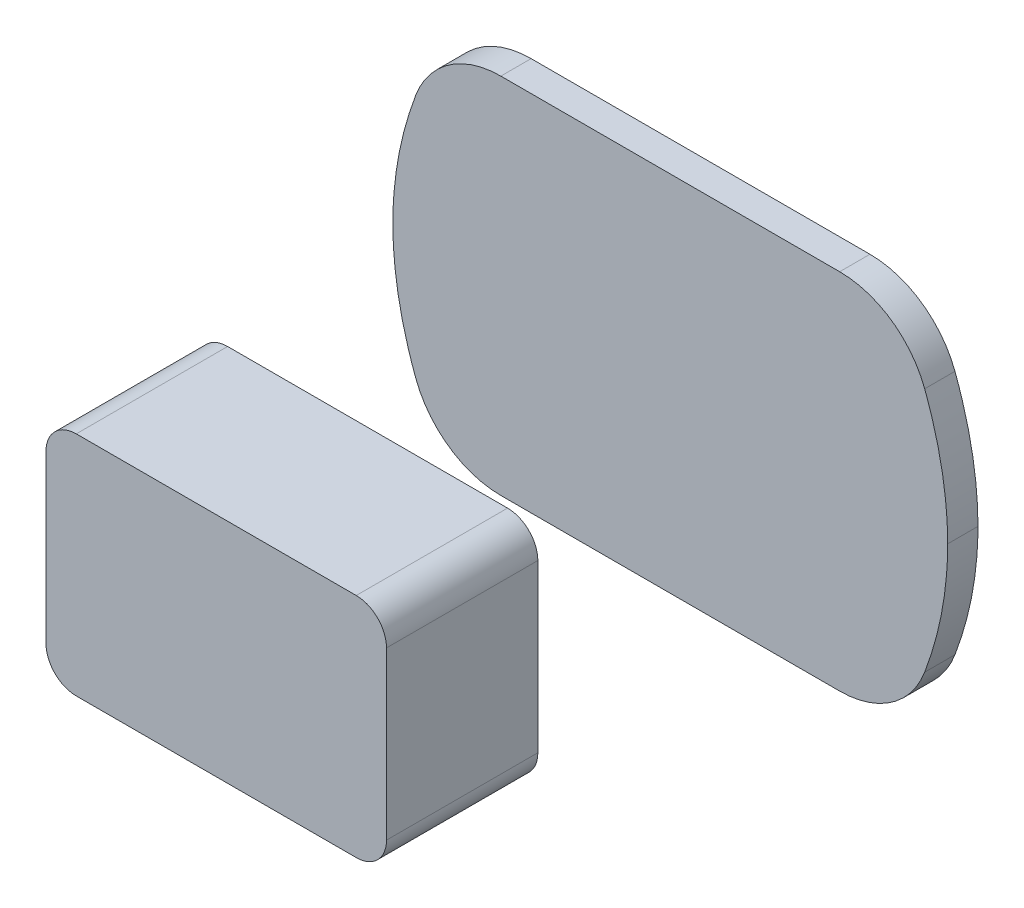
ISO-10303-21;
HEADER;
FILE_DESCRIPTION(('STEP AP214'),'2;1');
FILE_NAME('part.step','',(''),(''),'','','');
FILE_SCHEMA(('AUTOMOTIVE_DESIGN { 1 0 10303 214 1 1 1 1 }'));
ENDSEC;
DATA;
#1=APPLICATION_CONTEXT('core data for automotive mechanical design processes');
#2=APPLICATION_PROTOCOL_DEFINITION('international standard','automotive_design',2000,#1);
#3=PRODUCT_CONTEXT('',#1,'mechanical');
#4=PRODUCT('Part','Part','',(#3));
#5=PRODUCT_RELATED_PRODUCT_CATEGORY('part','',(#4));
#6=PRODUCT_DEFINITION_FORMATION('','',#4);
#7=PRODUCT_DEFINITION_CONTEXT('part definition',#1,'design');
#8=PRODUCT_DEFINITION('design','',#6,#7);
#9=PRODUCT_DEFINITION_SHAPE('','',#8);
#10=(LENGTH_UNIT() NAMED_UNIT(*) SI_UNIT(.MILLI.,.METRE.));
#11=(NAMED_UNIT(*) PLANE_ANGLE_UNIT() SI_UNIT($,.RADIAN.));
#12=(NAMED_UNIT(*) SI_UNIT($,.STERADIAN.) SOLID_ANGLE_UNIT());
#13=UNCERTAINTY_MEASURE_WITH_UNIT(LENGTH_MEASURE(1.E-05),#10,'distance_accuracy_value','');
#14=(GEOMETRIC_REPRESENTATION_CONTEXT(3) GLOBAL_UNCERTAINTY_ASSIGNED_CONTEXT((#13)) GLOBAL_UNIT_ASSIGNED_CONTEXT((#10,
#11,#12)) REPRESENTATION_CONTEXT('',''));
#15=CARTESIAN_POINT('',(0.,0.,0.));
#16=DIRECTION('',(0.,0.,1.));
#17=DIRECTION('',(1.,0.,0.));
#18=AXIS2_PLACEMENT_3D('',#15,#16,#17);
#19=CARTESIAN_POINT('',(-18.3347125977728,0.,-2.));
#20=CARTESIAN_POINT('',(-18.3271627106579,-2.72613066147478,-2.));
#21=CARTESIAN_POINT('',(-17.8195108498582,-5.42651764525177,-2.));
#22=CARTESIAN_POINT('',(-16.8116848744019,-8.10972166686572,-2.));
#23=B_SPLINE_CURVE_WITH_KNOTS('',3,(#19,#20,#21,#22),.UNSPECIFIED.,.F.,.F.,(4,4),
(0.502499344077156,0.83790507370678),.UNSPECIFIED.);
#24=DIRECTION('',(0.,0.,1.));
#25=VECTOR('',#24,1.);
#26=SURFACE_OF_LINEAR_EXTRUSION('',#23,#25);
#27=CARTESIAN_POINT('',(-18.3347125977728,0.,0.));
#28=CARTESIAN_POINT('',(-18.3271627106579,-2.72613066147478,0.));
#29=CARTESIAN_POINT('',(-17.8195108498582,-5.42651764525177,0.));
#30=CARTESIAN_POINT('',(-16.8116848744019,-8.10972166686572,0.));
#31=B_SPLINE_CURVE_WITH_KNOTS('',3,(#27,#28,#29,#30),.UNSPECIFIED.,.F.,.F.,(4,4),
(0.502499344077156,0.83790507370678),.UNSPECIFIED.);
#32=CARTESIAN_POINT('',(-18.3347125977728,0.,0.));
#33=VERTEX_POINT('',#32);
#34=CARTESIAN_POINT('',(-16.8116848744019,-8.10972166686573,0.));
#35=VERTEX_POINT('',#34);
#36=EDGE_CURVE('E158',#33,#35,#31,.T.);
#37=ORIENTED_EDGE('',*,*,#36,.F.);
#38=DIRECTION('',(0.,0.,1.));
#39=VECTOR('',#38,1.);
#40=CARTESIAN_POINT('',(-18.3347125977728,0.,-2.));
#41=LINE('',#40,#39);
#42=CARTESIAN_POINT('',(-18.3347125977728,0.,-2.));
#43=VERTEX_POINT('',#42);
#44=EDGE_CURVE('E12',#43,#33,#41,.T.);
#45=ORIENTED_EDGE('',*,*,#44,.F.);
#46=CARTESIAN_POINT('',(-16.8116848744019,-8.10972166686573,-2.));
#47=VERTEX_POINT('',#46);
#48=EDGE_CURVE('E210',#43,#47,#23,.T.);
#49=ORIENTED_EDGE('',*,*,#48,.T.);
#50=DIRECTION('',(0.,0.,1.));
#51=VECTOR('',#50,1.);
#52=CARTESIAN_POINT('',(-16.8116848744019,-8.10972166686573,-2.));
#53=LINE('',#52,#51);
#54=EDGE_CURVE('E49',#47,#35,#53,.T.);
#55=ORIENTED_EDGE('',*,*,#54,.T.);
#56=EDGE_LOOP('',(#37,#45,#49,#55));
#57=FACE_BOUND('',#56,.T.);
#58=ADVANCED_FACE('F45',(#57),#26,.T.);
#59=CARTESIAN_POINT('',(-16.8116848744019,8.10972166686572,-2.));
#60=CARTESIAN_POINT('',(-17.8195108498582,5.42651764525177,-2.));
#61=CARTESIAN_POINT('',(-18.3271627106579,2.72613066147478,-2.));
#62=CARTESIAN_POINT('',(-18.3347125977728,0.,-2.));
#63=B_SPLINE_CURVE_WITH_KNOTS('',3,(#59,#60,#61,#62),.UNSPECIFIED.,.F.,.F.,(4,4),
(0.502499344077156,0.83790507370678),.UNSPECIFIED.);
#64=DIRECTION('',(0.,0.,1.));
#65=VECTOR('',#64,1.);
#66=SURFACE_OF_LINEAR_EXTRUSION('',#63,#65);
#67=CARTESIAN_POINT('',(-16.8116848744019,8.10972166686572,0.));
#68=CARTESIAN_POINT('',(-17.8195108498582,5.42651764525177,0.));
#69=CARTESIAN_POINT('',(-18.3271627106579,2.72613066147478,0.));
#70=CARTESIAN_POINT('',(-18.3347125977728,0.,0.));
#71=B_SPLINE_CURVE_WITH_KNOTS('',3,(#67,#68,#69,#70),.UNSPECIFIED.,.F.,.F.,(4,4),
(0.502499344077156,0.83790507370678),.UNSPECIFIED.);
#72=CARTESIAN_POINT('',(-16.8116848744019,8.10972166686572,0.));
#73=VERTEX_POINT('',#72);
#74=EDGE_CURVE('E214',#73,#33,#71,.T.);
#75=ORIENTED_EDGE('',*,*,#74,.F.);
#76=DIRECTION('',(0.,0.,1.));
#77=VECTOR('',#76,1.);
#78=CARTESIAN_POINT('',(-16.8116848744019,8.10972166686572,-2.));
#79=LINE('',#78,#77);
#80=CARTESIAN_POINT('',(-16.8116848744019,8.10972166686572,-2.));
#81=VERTEX_POINT('',#80);
#82=EDGE_CURVE('E55',#81,#73,#79,.T.);
#83=ORIENTED_EDGE('',*,*,#82,.F.);
#84=EDGE_CURVE('E145',#81,#43,#63,.T.);
#85=ORIENTED_EDGE('',*,*,#84,.T.);
#86=ORIENTED_EDGE('',*,*,#44,.T.);
#87=EDGE_LOOP('',(#75,#83,#85,#86));
#88=FACE_BOUND('',#87,.T.);
#89=ADVANCED_FACE('F166',(#88),#66,.T.);
#90=CARTESIAN_POINT('',(-11.1948285927834,6.,-2.));
#91=DIRECTION('',(0.,0.,1.));
#92=DIRECTION('',(1.,0.,0.));
#93=AXIS2_PLACEMENT_3D('',#90,#91,#92);
#94=CYLINDRICAL_SURFACE('',#93,5.99999999999999);
#95=CARTESIAN_POINT('',(-11.1948285927834,6.,0.));
#96=DIRECTION('',(0.,0.,1.));
#97=DIRECTION('',(1.,0.,0.));
#98=AXIS2_PLACEMENT_3D('',#95,#96,#97);
#99=CIRCLE('',#98,5.99999999999999);
#100=CARTESIAN_POINT('',(-11.1948285927834,12.,0.));
#101=VERTEX_POINT('',#100);
#102=EDGE_CURVE('E132',#101,#73,#99,.T.);
#103=ORIENTED_EDGE('',*,*,#102,.F.);
#104=DIRECTION('',(0.,0.,1.));
#105=VECTOR('',#104,1.);
#106=CARTESIAN_POINT('',(-11.1948285927834,12.,-2.));
#107=LINE('',#106,#105);
#108=CARTESIAN_POINT('',(-11.1948285927834,12.,-2.));
#109=VERTEX_POINT('',#108);
#110=EDGE_CURVE('E127',#109,#101,#107,.T.);
#111=ORIENTED_EDGE('',*,*,#110,.F.);
#112=CARTESIAN_POINT('',(-11.1948285927834,6.,-2.));
#113=DIRECTION('',(0.,0.,1.));
#114=DIRECTION('',(1.,0.,0.));
#115=AXIS2_PLACEMENT_3D('',#112,#113,#114);
#116=CIRCLE('',#115,5.99999999999999);
#117=EDGE_CURVE('E130',#109,#81,#116,.T.);
#118=ORIENTED_EDGE('',*,*,#117,.T.);
#119=ORIENTED_EDGE('',*,*,#82,.T.);
#120=EDGE_LOOP('',(#103,#111,#118,#119));
#121=FACE_BOUND('',#120,.T.);
#122=ADVANCED_FACE('F129',(#121),#94,.T.);
#123=CARTESIAN_POINT('',(-11.1948285927834,12.,-2.));
#124=DIRECTION('',(0.,1.,0.));
#125=DIRECTION('',(0.,0.,1.));
#126=AXIS2_PLACEMENT_3D('',#123,#124,#125);
#127=PLANE('',#126);
#128=DIRECTION('',(-1.,0.,0.));
#129=VECTOR('',#128,1.);
#130=CARTESIAN_POINT('',(-11.1948285927834,12.,0.));
#131=LINE('',#130,#129);
#132=CARTESIAN_POINT('',(11.1948285927834,12.,0.));
#133=VERTEX_POINT('',#132);
#134=EDGE_CURVE('E222',#133,#101,#131,.T.);
#135=ORIENTED_EDGE('',*,*,#134,.F.);
#136=DIRECTION('',(0.,0.,1.));
#137=VECTOR('',#136,1.);
#138=CARTESIAN_POINT('',(11.1948285927834,12.,-2.));
#139=LINE('',#138,#137);
#140=CARTESIAN_POINT('',(11.1948285927834,12.,-2.));
#141=VERTEX_POINT('',#140);
#142=EDGE_CURVE('E137',#141,#133,#139,.T.);
#143=ORIENTED_EDGE('',*,*,#142,.F.);
#144=DIRECTION('',(-1.,0.,0.));
#145=VECTOR('',#144,1.);
#146=CARTESIAN_POINT('',(-11.1948285927834,12.,-2.));
#147=LINE('',#146,#145);
#148=EDGE_CURVE('E143',#141,#109,#147,.T.);
#149=ORIENTED_EDGE('',*,*,#148,.T.);
#150=ORIENTED_EDGE('',*,*,#110,.T.);
#151=EDGE_LOOP('',(#135,#143,#149,#150));
#152=FACE_BOUND('',#151,.T.);
#153=ADVANCED_FACE('F147',(#152),#127,.T.);
#154=CARTESIAN_POINT('',(11.1948285927834,6.,-2.));
#155=DIRECTION('',(0.,0.,1.));
#156=DIRECTION('',(1.,0.,0.));
#157=AXIS2_PLACEMENT_3D('',#154,#155,#156);
#158=CYLINDRICAL_SURFACE('',#157,5.99999999999999);
#159=CARTESIAN_POINT('',(11.1948285927834,6.,0.));
#160=DIRECTION('',(0.,0.,1.));
#161=DIRECTION('',(-1.,0.,0.));
#162=AXIS2_PLACEMENT_3D('',#159,#160,#161);
#163=CIRCLE('',#162,5.99999999999999);
#164=CARTESIAN_POINT('',(16.8116848744019,8.10972166686573,0.));
#165=VERTEX_POINT('',#164);
#166=EDGE_CURVE('E352',#165,#133,#163,.T.);
#167=ORIENTED_EDGE('',*,*,#166,.F.);
#168=DIRECTION('',(0.,0.,1.));
#169=VECTOR('',#168,1.);
#170=CARTESIAN_POINT('',(16.8116848744019,8.10972166686573,-2.));
#171=LINE('',#170,#169);
#172=CARTESIAN_POINT('',(16.8116848744019,8.10972166686573,-2.));
#173=VERTEX_POINT('',#172);
#174=EDGE_CURVE('E233',#173,#165,#171,.T.);
#175=ORIENTED_EDGE('',*,*,#174,.F.);
#176=CARTESIAN_POINT('',(11.1948285927834,6.,-2.));
#177=DIRECTION('',(0.,0.,1.));
#178=DIRECTION('',(-1.,0.,0.));
#179=AXIS2_PLACEMENT_3D('',#176,#177,#178);
#180=CIRCLE('',#179,5.99999999999999);
#181=EDGE_CURVE('E148',#173,#141,#180,.T.);
#182=ORIENTED_EDGE('',*,*,#181,.T.);
#183=ORIENTED_EDGE('',*,*,#142,.T.);
#184=EDGE_LOOP('',(#167,#175,#182,#183));
#185=FACE_BOUND('',#184,.T.);
#186=ADVANCED_FACE('F176',(#185),#158,.T.);
#187=CARTESIAN_POINT('',(18.3347125977728,0.,-2.));
#188=CARTESIAN_POINT('',(18.3271627106579,2.72613066147478,-2.));
#189=CARTESIAN_POINT('',(17.8195108498582,5.42651764525177,-2.));
#190=CARTESIAN_POINT('',(16.8116848744019,8.10972166686572,-2.));
#191=B_SPLINE_CURVE_WITH_KNOTS('',3,(#187,#188,#189,#190),.UNSPECIFIED.,.F.,.F.,(4,4),
(0.502499344077156,0.83790507370678),.UNSPECIFIED.);
#192=DIRECTION('',(0.,0.,1.));
#193=VECTOR('',#192,1.);
#194=SURFACE_OF_LINEAR_EXTRUSION('',#191,#193);
#195=CARTESIAN_POINT('',(18.3347125977728,0.,0.));
#196=CARTESIAN_POINT('',(18.3271627106579,2.72613066147478,0.));
#197=CARTESIAN_POINT('',(17.8195108498582,5.42651764525177,0.));
#198=CARTESIAN_POINT('',(16.8116848744019,8.10972166686572,0.));
#199=B_SPLINE_CURVE_WITH_KNOTS('',3,(#195,#196,#197,#198),.UNSPECIFIED.,.F.,.F.,(4,4),
(0.502499344077156,0.83790507370678),.UNSPECIFIED.);
#200=CARTESIAN_POINT('',(18.3347125977728,0.,0.));
#201=VERTEX_POINT('',#200);
#202=EDGE_CURVE('E344',#201,#165,#199,.T.);
#203=ORIENTED_EDGE('',*,*,#202,.F.);
#204=DIRECTION('',(0.,0.,1.));
#205=VECTOR('',#204,1.);
#206=CARTESIAN_POINT('',(18.3347125977728,0.,-2.));
#207=LINE('',#206,#205);
#208=CARTESIAN_POINT('',(18.3347125977728,0.,-2.));
#209=VERTEX_POINT('',#208);
#210=EDGE_CURVE('E235',#209,#201,#207,.T.);
#211=ORIENTED_EDGE('',*,*,#210,.F.);
#212=EDGE_CURVE('E150',#209,#173,#191,.T.);
#213=ORIENTED_EDGE('',*,*,#212,.T.);
#214=ORIENTED_EDGE('',*,*,#174,.T.);
#215=EDGE_LOOP('',(#203,#211,#213,#214));
#216=FACE_BOUND('',#215,.T.);
#217=ADVANCED_FACE('F179',(#216),#194,.T.);
#218=CARTESIAN_POINT('',(16.8116848744019,-8.10972166686572,-2.));
#219=CARTESIAN_POINT('',(17.8195108498582,-5.42651764525177,-2.));
#220=CARTESIAN_POINT('',(18.3271627106579,-2.72613066147478,-2.));
#221=CARTESIAN_POINT('',(18.3347125977728,0.,-2.));
#222=B_SPLINE_CURVE_WITH_KNOTS('',3,(#218,#219,#220,#221),.UNSPECIFIED.,.F.,.F.,(4,4),
(0.502499344077156,0.83790507370678),.UNSPECIFIED.);
#223=DIRECTION('',(0.,0.,1.));
#224=VECTOR('',#223,1.);
#225=SURFACE_OF_LINEAR_EXTRUSION('',#222,#224);
#226=CARTESIAN_POINT('',(16.8116848744019,-8.10972166686572,0.));
#227=CARTESIAN_POINT('',(17.8195108498582,-5.42651764525177,0.));
#228=CARTESIAN_POINT('',(18.3271627106579,-2.72613066147478,0.));
#229=CARTESIAN_POINT('',(18.3347125977728,0.,0.));
#230=B_SPLINE_CURVE_WITH_KNOTS('',3,(#226,#227,#228,#229),.UNSPECIFIED.,.F.,.F.,(4,4),
(0.502499344077156,0.83790507370678),.UNSPECIFIED.);
#231=CARTESIAN_POINT('',(16.8116848744019,-8.10972166686572,0.));
#232=VERTEX_POINT('',#231);
#233=EDGE_CURVE('E337',#232,#201,#230,.T.);
#234=ORIENTED_EDGE('',*,*,#233,.F.);
#235=DIRECTION('',(0.,0.,1.));
#236=VECTOR('',#235,1.);
#237=CARTESIAN_POINT('',(16.8116848744019,-8.10972166686572,-2.));
#238=LINE('',#237,#236);
#239=CARTESIAN_POINT('',(16.8116848744019,-8.10972166686572,-2.));
#240=VERTEX_POINT('',#239);
#241=EDGE_CURVE('E237',#240,#232,#238,.T.);
#242=ORIENTED_EDGE('',*,*,#241,.F.);
#243=EDGE_CURVE('E191',#240,#209,#222,.T.);
#244=ORIENTED_EDGE('',*,*,#243,.T.);
#245=ORIENTED_EDGE('',*,*,#210,.T.);
#246=EDGE_LOOP('',(#234,#242,#244,#245));
#247=FACE_BOUND('',#246,.T.);
#248=ADVANCED_FACE('F183',(#247),#225,.T.);
#249=CARTESIAN_POINT('',(11.1948285927834,-6.,-2.));
#250=DIRECTION('',(0.,0.,1.));
#251=DIRECTION('',(1.,0.,0.));
#252=AXIS2_PLACEMENT_3D('',#249,#250,#251);
#253=CYLINDRICAL_SURFACE('',#252,5.99999999999999);
#254=CARTESIAN_POINT('',(11.1948285927834,-6.,0.));
#255=DIRECTION('',(0.,0.,1.));
#256=DIRECTION('',(1.,0.,0.));
#257=AXIS2_PLACEMENT_3D('',#254,#255,#256);
#258=CIRCLE('',#257,5.99999999999999);
#259=CARTESIAN_POINT('',(11.1948285927834,-12.,0.));
#260=VERTEX_POINT('',#259);
#261=EDGE_CURVE('E335',#260,#232,#258,.T.);
#262=ORIENTED_EDGE('',*,*,#261,.F.);
#263=DIRECTION('',(0.,0.,1.));
#264=VECTOR('',#263,1.);
#265=CARTESIAN_POINT('',(11.1948285927834,-12.,-2.));
#266=LINE('',#265,#264);
#267=CARTESIAN_POINT('',(11.1948285927834,-12.,-2.));
#268=VERTEX_POINT('',#267);
#269=EDGE_CURVE('E239',#268,#260,#266,.T.);
#270=ORIENTED_EDGE('',*,*,#269,.F.);
#271=CARTESIAN_POINT('',(11.1948285927834,-6.,-2.));
#272=DIRECTION('',(0.,0.,1.));
#273=DIRECTION('',(1.,0.,0.));
#274=AXIS2_PLACEMENT_3D('',#271,#272,#273);
#275=CIRCLE('',#274,5.99999999999999);
#276=EDGE_CURVE('E200',#268,#240,#275,.T.);
#277=ORIENTED_EDGE('',*,*,#276,.T.);
#278=ORIENTED_EDGE('',*,*,#241,.T.);
#279=EDGE_LOOP('',(#262,#270,#277,#278));
#280=FACE_BOUND('',#279,.T.);
#281=ADVANCED_FACE('F280',(#280),#253,.T.);
#282=CARTESIAN_POINT('',(-11.1948285927834,-12.,-2.));
#283=DIRECTION('',(0.,-1.,0.));
#284=DIRECTION('',(0.,0.,-1.));
#285=AXIS2_PLACEMENT_3D('',#282,#283,#284);
#286=PLANE('',#285);
#287=DIRECTION('',(1.,0.,0.));
#288=VECTOR('',#287,1.);
#289=CARTESIAN_POINT('',(-11.1948285927834,-12.,0.));
#290=LINE('',#289,#288);
#291=CARTESIAN_POINT('',(-11.1948285927834,-12.,0.));
#292=VERTEX_POINT('',#291);
#293=EDGE_CURVE('E246',#292,#260,#290,.T.);
#294=ORIENTED_EDGE('',*,*,#293,.F.);
#295=DIRECTION('',(0.,0.,1.));
#296=VECTOR('',#295,1.);
#297=CARTESIAN_POINT('',(-11.1948285927834,-12.,-2.));
#298=LINE('',#297,#296);
#299=CARTESIAN_POINT('',(-11.1948285927834,-12.,-2.));
#300=VERTEX_POINT('',#299);
#301=EDGE_CURVE('E240',#300,#292,#298,.T.);
#302=ORIENTED_EDGE('',*,*,#301,.F.);
#303=DIRECTION('',(1.,0.,0.));
#304=VECTOR('',#303,1.);
#305=CARTESIAN_POINT('',(-11.1948285927834,-12.,-2.));
#306=LINE('',#305,#304);
#307=EDGE_CURVE('E206',#300,#268,#306,.T.);
#308=ORIENTED_EDGE('',*,*,#307,.T.);
#309=ORIENTED_EDGE('',*,*,#269,.T.);
#310=EDGE_LOOP('',(#294,#302,#308,#309));
#311=FACE_BOUND('',#310,.T.);
#312=ADVANCED_FACE('F287',(#311),#286,.T.);
#313=CARTESIAN_POINT('',(-11.1948285927834,-6.,-2.));
#314=DIRECTION('',(0.,0.,1.));
#315=DIRECTION('',(1.,0.,0.));
#316=AXIS2_PLACEMENT_3D('',#313,#314,#315);
#317=CYLINDRICAL_SURFACE('',#316,5.99999999999999);
#318=CARTESIAN_POINT('',(-11.1948285927834,-6.,0.));
#319=DIRECTION('',(0.,0.,1.));
#320=DIRECTION('',(-1.,0.,0.));
#321=AXIS2_PLACEMENT_3D('',#318,#319,#320);
#322=CIRCLE('',#321,5.99999999999999);
#323=EDGE_CURVE('E243',#35,#292,#322,.T.);
#324=ORIENTED_EDGE('',*,*,#323,.F.);
#325=ORIENTED_EDGE('',*,*,#54,.F.);
#326=CARTESIAN_POINT('',(-11.1948285927834,-6.,-2.));
#327=DIRECTION('',(0.,0.,1.));
#328=DIRECTION('',(-1.,0.,0.));
#329=AXIS2_PLACEMENT_3D('',#326,#327,#328);
#330=CIRCLE('',#329,5.99999999999999);
#331=EDGE_CURVE('E209',#47,#300,#330,.T.);
#332=ORIENTED_EDGE('',*,*,#331,.T.);
#333=ORIENTED_EDGE('',*,*,#301,.T.);
#334=EDGE_LOOP('',(#324,#325,#332,#333));
#335=FACE_BOUND('',#334,.T.);
#336=ADVANCED_FACE('F244',(#335),#317,.T.);
#337=CARTESIAN_POINT('',(-17.9483022692154,-4.07095832338067,-2.));
#338=DIRECTION('',(0.,0.,-1.));
#339=DIRECTION('',(-1.,0.,0.));
#340=AXIS2_PLACEMENT_3D('',#337,#338,#339);
#341=PLANE('',#340);
#342=ORIENTED_EDGE('',*,*,#48,.F.);
#343=ORIENTED_EDGE('',*,*,#84,.F.);
#344=ORIENTED_EDGE('',*,*,#117,.F.);
#345=ORIENTED_EDGE('',*,*,#148,.F.);
#346=ORIENTED_EDGE('',*,*,#181,.F.);
#347=ORIENTED_EDGE('',*,*,#212,.F.);
#348=ORIENTED_EDGE('',*,*,#243,.F.);
#349=ORIENTED_EDGE('',*,*,#276,.F.);
#350=ORIENTED_EDGE('',*,*,#307,.F.);
#351=ORIENTED_EDGE('',*,*,#331,.F.);
#352=EDGE_LOOP('',(#342,#343,#344,#345,#346,#347,#348,#349,#350,#351));
#353=FACE_BOUND('',#352,.T.);
#354=ADVANCED_FACE('F141',(#353),#341,.T.);
#355=CARTESIAN_POINT('',(-17.9483022692154,-4.07095832338067,0.));
#356=DIRECTION('',(0.,0.,-1.));
#357=DIRECTION('',(-1.,0.,0.));
#358=AXIS2_PLACEMENT_3D('',#355,#356,#357);
#359=PLANE('',#358);
#360=ORIENTED_EDGE('',*,*,#36,.T.);
#361=ORIENTED_EDGE('',*,*,#323,.T.);
#362=ORIENTED_EDGE('',*,*,#293,.T.);
#363=ORIENTED_EDGE('',*,*,#261,.T.);
#364=ORIENTED_EDGE('',*,*,#233,.T.);
#365=ORIENTED_EDGE('',*,*,#202,.T.);
#366=ORIENTED_EDGE('',*,*,#166,.T.);
#367=ORIENTED_EDGE('',*,*,#134,.T.);
#368=ORIENTED_EDGE('',*,*,#102,.T.);
#369=ORIENTED_EDGE('',*,*,#74,.T.);
#370=EDGE_LOOP('',(#360,#361,#362,#363,#364,#365,#366,#367,#368,#369));
#371=FACE_BOUND('',#370,.T.);
#372=ADVANCED_FACE('F170',(#371),#359,.F.);
#373=CLOSED_SHELL('',(#58,#89,#122,#153,#186,#217,#248,#281,#312,#336,#354,#372));
#374=MANIFOLD_SOLID_BREP('B2',#373);
#375=CARTESIAN_POINT('',(9.25,-5.5,30.));
#376=DIRECTION('',(0.,0.,-1.));
#377=DIRECTION('',(-1.,0.,0.));
#378=AXIS2_PLACEMENT_3D('',#375,#376,#377);
#379=CYLINDRICAL_SURFACE('',#378,2.);
#380=CARTESIAN_POINT('',(9.25,-5.5,20.));
#381=DIRECTION('',(0.,0.,1.));
#382=DIRECTION('',(-1.,0.,0.));
#383=AXIS2_PLACEMENT_3D('',#380,#381,#382);
#384=CIRCLE('',#383,2.);
#385=CARTESIAN_POINT('',(9.25,-7.5,20.));
#386=VERTEX_POINT('',#385);
#387=CARTESIAN_POINT('',(11.25,-5.5,20.));
#388=VERTEX_POINT('',#387);
#389=EDGE_CURVE('E463',#386,#388,#384,.T.);
#390=ORIENTED_EDGE('',*,*,#389,.T.);
#391=DIRECTION('',(0.,0.,-1.));
#392=VECTOR('',#391,1.);
#393=CARTESIAN_POINT('',(11.25,-5.5,30.));
#394=LINE('',#393,#392);
#395=CARTESIAN_POINT('',(11.25,-5.5,30.));
#396=VERTEX_POINT('',#395);
#397=EDGE_CURVE('E43',#396,#388,#394,.T.);
#398=ORIENTED_EDGE('',*,*,#397,.F.);
#399=CARTESIAN_POINT('',(9.25,-5.5,30.));
#400=DIRECTION('',(0.,0.,1.));
#401=DIRECTION('',(-1.,0.,0.));
#402=AXIS2_PLACEMENT_3D('',#399,#400,#401);
#403=CIRCLE('',#402,2.);
#404=CARTESIAN_POINT('',(9.25,-7.5,30.));
#405=VERTEX_POINT('',#404);
#406=EDGE_CURVE('E482',#405,#396,#403,.T.);
#407=ORIENTED_EDGE('',*,*,#406,.F.);
#408=DIRECTION('',(0.,0.,-1.));
#409=VECTOR('',#408,1.);
#410=CARTESIAN_POINT('',(9.25,-7.5,30.));
#411=LINE('',#410,#409);
#412=EDGE_CURVE('E419',#405,#386,#411,.T.);
#413=ORIENTED_EDGE('',*,*,#412,.T.);
#414=EDGE_LOOP('',(#390,#398,#407,#413));
#415=FACE_BOUND('',#414,.T.);
#416=ADVANCED_FACE('F369',(#415),#379,.T.);
#417=CARTESIAN_POINT('',(11.25,-5.5,30.));
#418=DIRECTION('',(-1.,0.,0.));
#419=DIRECTION('',(0.,0.,1.));
#420=AXIS2_PLACEMENT_3D('',#417,#418,#419);
#421=PLANE('',#420);
#422=DIRECTION('',(0.,1.,0.));
#423=VECTOR('',#422,1.);
#424=CARTESIAN_POINT('',(11.25,-5.5,20.));
#425=LINE('',#424,#423);
#426=CARTESIAN_POINT('',(11.25,5.5,20.));
#427=VERTEX_POINT('',#426);
#428=EDGE_CURVE('E465',#388,#427,#425,.T.);
#429=ORIENTED_EDGE('',*,*,#428,.T.);
#430=DIRECTION('',(0.,0.,-1.));
#431=VECTOR('',#430,1.);
#432=CARTESIAN_POINT('',(11.25,5.5,30.));
#433=LINE('',#432,#431);
#434=CARTESIAN_POINT('',(11.25,5.5,30.));
#435=VERTEX_POINT('',#434);
#436=EDGE_CURVE('E377',#435,#427,#433,.T.);
#437=ORIENTED_EDGE('',*,*,#436,.F.);
#438=DIRECTION('',(0.,1.,0.));
#439=VECTOR('',#438,1.);
#440=CARTESIAN_POINT('',(11.25,-5.5,30.));
#441=LINE('',#440,#439);
#442=EDGE_CURVE('E426',#396,#435,#441,.T.);
#443=ORIENTED_EDGE('',*,*,#442,.F.);
#444=ORIENTED_EDGE('',*,*,#397,.T.);
#445=EDGE_LOOP('',(#429,#437,#443,#444));
#446=FACE_BOUND('',#445,.T.);
#447=ADVANCED_FACE('F497',(#446),#421,.F.);
#448=CARTESIAN_POINT('',(9.25,5.5,30.));
#449=DIRECTION('',(0.,0.,-1.));
#450=DIRECTION('',(-1.,0.,0.));
#451=AXIS2_PLACEMENT_3D('',#448,#449,#450);
#452=CYLINDRICAL_SURFACE('',#451,2.);
#453=CARTESIAN_POINT('',(9.25,5.5,20.));
#454=DIRECTION('',(0.,0.,1.));
#455=DIRECTION('',(-1.,0.,0.));
#456=AXIS2_PLACEMENT_3D('',#453,#454,#455);
#457=CIRCLE('',#456,2.);
#458=CARTESIAN_POINT('',(9.25,7.5,20.));
#459=VERTEX_POINT('',#458);
#460=EDGE_CURVE('E468',#427,#459,#457,.T.);
#461=ORIENTED_EDGE('',*,*,#460,.T.);
#462=DIRECTION('',(0.,0.,-1.));
#463=VECTOR('',#462,1.);
#464=CARTESIAN_POINT('',(9.25,7.5,30.));
#465=LINE('',#464,#463);
#466=CARTESIAN_POINT('',(9.25,7.5,30.));
#467=VERTEX_POINT('',#466);
#468=EDGE_CURVE('E488',#467,#459,#465,.T.);
#469=ORIENTED_EDGE('',*,*,#468,.F.);
#470=CARTESIAN_POINT('',(9.25,5.5,30.));
#471=DIRECTION('',(0.,0.,1.));
#472=DIRECTION('',(-1.,0.,0.));
#473=AXIS2_PLACEMENT_3D('',#470,#471,#472);
#474=CIRCLE('',#473,2.);
#475=EDGE_CURVE('E495',#435,#467,#474,.T.);
#476=ORIENTED_EDGE('',*,*,#475,.F.);
#477=ORIENTED_EDGE('',*,*,#436,.T.);
#478=EDGE_LOOP('',(#461,#469,#476,#477));
#479=FACE_BOUND('',#478,.T.);
#480=ADVANCED_FACE('F491',(#479),#452,.T.);
#481=CARTESIAN_POINT('',(-9.25,7.5,30.));
#482=DIRECTION('',(0.,-1.,0.));
#483=DIRECTION('',(0.,0.,-1.));
#484=AXIS2_PLACEMENT_3D('',#481,#482,#483);
#485=PLANE('',#484);
#486=DIRECTION('',(-1.,0.,0.));
#487=VECTOR('',#486,1.);
#488=CARTESIAN_POINT('',(-9.25,7.5,20.));
#489=LINE('',#488,#487);
#490=CARTESIAN_POINT('',(-9.25,7.5,20.));
#491=VERTEX_POINT('',#490);
#492=EDGE_CURVE('E471',#459,#491,#489,.T.);
#493=ORIENTED_EDGE('',*,*,#492,.T.);
#494=DIRECTION('',(0.,0.,-1.));
#495=VECTOR('',#494,1.);
#496=CARTESIAN_POINT('',(-9.25,7.5,30.));
#497=LINE('',#496,#495);
#498=CARTESIAN_POINT('',(-9.25,7.5,30.));
#499=VERTEX_POINT('',#498);
#500=EDGE_CURVE('E486',#499,#491,#497,.T.);
#501=ORIENTED_EDGE('',*,*,#500,.F.);
#502=DIRECTION('',(-1.,0.,0.));
#503=VECTOR('',#502,1.);
#504=CARTESIAN_POINT('',(-9.25,7.5,30.));
#505=LINE('',#504,#503);
#506=EDGE_CURVE('E507',#467,#499,#505,.T.);
#507=ORIENTED_EDGE('',*,*,#506,.F.);
#508=ORIENTED_EDGE('',*,*,#468,.T.);
#509=EDGE_LOOP('',(#493,#501,#507,#508));
#510=FACE_BOUND('',#509,.T.);
#511=ADVANCED_FACE('F505',(#510),#485,.F.);
#512=CARTESIAN_POINT('',(-9.25,5.5,30.));
#513=DIRECTION('',(0.,0.,-1.));
#514=DIRECTION('',(-1.,0.,0.));
#515=AXIS2_PLACEMENT_3D('',#512,#513,#514);
#516=CYLINDRICAL_SURFACE('',#515,2.);
#517=CARTESIAN_POINT('',(-9.25,5.5,20.));
#518=DIRECTION('',(0.,0.,1.));
#519=DIRECTION('',(1.,0.,0.));
#520=AXIS2_PLACEMENT_3D('',#517,#518,#519);
#521=CIRCLE('',#520,2.);
#522=CARTESIAN_POINT('',(-11.25,5.5,20.));
#523=VERTEX_POINT('',#522);
#524=EDGE_CURVE('E474',#491,#523,#521,.T.);
#525=ORIENTED_EDGE('',*,*,#524,.T.);
#526=DIRECTION('',(0.,0.,-1.));
#527=VECTOR('',#526,1.);
#528=CARTESIAN_POINT('',(-11.25,5.5,30.));
#529=LINE('',#528,#527);
#530=CARTESIAN_POINT('',(-11.25,5.5,30.));
#531=VERTEX_POINT('',#530);
#532=EDGE_CURVE('E456',#531,#523,#529,.T.);
#533=ORIENTED_EDGE('',*,*,#532,.F.);
#534=CARTESIAN_POINT('',(-9.25,5.5,30.));
#535=DIRECTION('',(0.,0.,1.));
#536=DIRECTION('',(1.,0.,0.));
#537=AXIS2_PLACEMENT_3D('',#534,#535,#536);
#538=CIRCLE('',#537,2.);
#539=EDGE_CURVE('E445',#499,#531,#538,.T.);
#540=ORIENTED_EDGE('',*,*,#539,.F.);
#541=ORIENTED_EDGE('',*,*,#500,.T.);
#542=EDGE_LOOP('',(#525,#533,#540,#541));
#543=FACE_BOUND('',#542,.T.);
#544=ADVANCED_FACE('F534',(#543),#516,.T.);
#545=CARTESIAN_POINT('',(-11.25,-5.5,30.));
#546=DIRECTION('',(1.,0.,0.));
#547=DIRECTION('',(0.,0.,-1.));
#548=AXIS2_PLACEMENT_3D('',#545,#546,#547);
#549=PLANE('',#548);
#550=DIRECTION('',(0.,-1.,0.));
#551=VECTOR('',#550,1.);
#552=CARTESIAN_POINT('',(-11.25,-5.5,20.));
#553=LINE('',#552,#551);
#554=CARTESIAN_POINT('',(-11.25,-5.5,20.));
#555=VERTEX_POINT('',#554);
#556=EDGE_CURVE('E453',#523,#555,#553,.T.);
#557=ORIENTED_EDGE('',*,*,#556,.T.);
#558=DIRECTION('',(0.,0.,-1.));
#559=VECTOR('',#558,1.);
#560=CARTESIAN_POINT('',(-11.25,-5.5,30.));
#561=LINE('',#560,#559);
#562=CARTESIAN_POINT('',(-11.25,-5.5,30.));
#563=VERTEX_POINT('',#562);
#564=EDGE_CURVE('E450',#563,#555,#561,.T.);
#565=ORIENTED_EDGE('',*,*,#564,.F.);
#566=DIRECTION('',(0.,-1.,0.));
#567=VECTOR('',#566,1.);
#568=CARTESIAN_POINT('',(-11.25,-5.5,30.));
#569=LINE('',#568,#567);
#570=EDGE_CURVE('E439',#531,#563,#569,.T.);
#571=ORIENTED_EDGE('',*,*,#570,.F.);
#572=ORIENTED_EDGE('',*,*,#532,.T.);
#573=EDGE_LOOP('',(#557,#565,#571,#572));
#574=FACE_BOUND('',#573,.T.);
#575=ADVANCED_FACE('F451',(#574),#549,.F.);
#576=CARTESIAN_POINT('',(-9.25,-5.5,30.));
#577=DIRECTION('',(0.,0.,-1.));
#578=DIRECTION('',(-1.,0.,0.));
#579=AXIS2_PLACEMENT_3D('',#576,#577,#578);
#580=CYLINDRICAL_SURFACE('',#579,2.);
#581=CARTESIAN_POINT('',(-9.25,-5.5,20.));
#582=DIRECTION('',(0.,0.,1.));
#583=DIRECTION('',(1.,0.,0.));
#584=AXIS2_PLACEMENT_3D('',#581,#582,#583);
#585=CIRCLE('',#584,2.);
#586=CARTESIAN_POINT('',(-9.25,-7.5,20.));
#587=VERTEX_POINT('',#586);
#588=EDGE_CURVE('E478',#555,#587,#585,.T.);
#589=ORIENTED_EDGE('',*,*,#588,.T.);
#590=DIRECTION('',(0.,0.,-1.));
#591=VECTOR('',#590,1.);
#592=CARTESIAN_POINT('',(-9.25,-7.5,30.));
#593=LINE('',#592,#591);
#594=CARTESIAN_POINT('',(-9.25,-7.5,30.));
#595=VERTEX_POINT('',#594);
#596=EDGE_CURVE('E412',#595,#587,#593,.T.);
#597=ORIENTED_EDGE('',*,*,#596,.F.);
#598=CARTESIAN_POINT('',(-9.25,-5.5,30.));
#599=DIRECTION('',(0.,0.,1.));
#600=DIRECTION('',(1.,0.,0.));
#601=AXIS2_PLACEMENT_3D('',#598,#599,#600);
#602=CIRCLE('',#601,2.);
#603=EDGE_CURVE('E443',#563,#595,#602,.T.);
#604=ORIENTED_EDGE('',*,*,#603,.F.);
#605=ORIENTED_EDGE('',*,*,#564,.T.);
#606=EDGE_LOOP('',(#589,#597,#604,#605));
#607=FACE_BOUND('',#606,.T.);
#608=ADVANCED_FACE('F458',(#607),#580,.T.);
#609=CARTESIAN_POINT('',(-9.25,-7.5,30.));
#610=DIRECTION('',(0.,1.,0.));
#611=DIRECTION('',(0.,0.,1.));
#612=AXIS2_PLACEMENT_3D('',#609,#610,#611);
#613=PLANE('',#612);
#614=DIRECTION('',(1.,0.,0.));
#615=VECTOR('',#614,1.);
#616=CARTESIAN_POINT('',(-9.25,-7.5,20.));
#617=LINE('',#616,#615);
#618=EDGE_CURVE('E480',#587,#386,#617,.T.);
#619=ORIENTED_EDGE('',*,*,#618,.T.);
#620=ORIENTED_EDGE('',*,*,#412,.F.);
#621=DIRECTION('',(1.,0.,0.));
#622=VECTOR('',#621,1.);
#623=CARTESIAN_POINT('',(-9.25,-7.5,30.));
#624=LINE('',#623,#622);
#625=EDGE_CURVE('E385',#595,#405,#624,.T.);
#626=ORIENTED_EDGE('',*,*,#625,.F.);
#627=ORIENTED_EDGE('',*,*,#596,.T.);
#628=EDGE_LOOP('',(#619,#620,#626,#627));
#629=FACE_BOUND('',#628,.T.);
#630=ADVANCED_FACE('F513',(#629),#613,.F.);
#631=CARTESIAN_POINT('',(9.25,-5.5,30.));
#632=DIRECTION('',(0.,0.,-1.));
#633=DIRECTION('',(-1.,0.,0.));
#634=AXIS2_PLACEMENT_3D('',#631,#632,#633);
#635=PLANE('',#634);
#636=ORIENTED_EDGE('',*,*,#406,.T.);
#637=ORIENTED_EDGE('',*,*,#442,.T.);
#638=ORIENTED_EDGE('',*,*,#475,.T.);
#639=ORIENTED_EDGE('',*,*,#506,.T.);
#640=ORIENTED_EDGE('',*,*,#539,.T.);
#641=ORIENTED_EDGE('',*,*,#570,.T.);
#642=ORIENTED_EDGE('',*,*,#603,.T.);
#643=ORIENTED_EDGE('',*,*,#625,.T.);
#644=EDGE_LOOP('',(#636,#637,#638,#639,#640,#641,#642,#643));
#645=FACE_BOUND('',#644,.T.);
#646=ADVANCED_FACE('F441',(#645),#635,.F.);
#647=CARTESIAN_POINT('',(9.25,-5.5,20.));
#648=DIRECTION('',(0.,0.,-1.));
#649=DIRECTION('',(-1.,0.,0.));
#650=AXIS2_PLACEMENT_3D('',#647,#648,#649);
#651=PLANE('',#650);
#652=ORIENTED_EDGE('',*,*,#389,.F.);
#653=ORIENTED_EDGE('',*,*,#618,.F.);
#654=ORIENTED_EDGE('',*,*,#588,.F.);
#655=ORIENTED_EDGE('',*,*,#556,.F.);
#656=ORIENTED_EDGE('',*,*,#524,.F.);
#657=ORIENTED_EDGE('',*,*,#492,.F.);
#658=ORIENTED_EDGE('',*,*,#460,.F.);
#659=ORIENTED_EDGE('',*,*,#428,.F.);
#660=EDGE_LOOP('',(#652,#653,#654,#655,#656,#657,#658,#659));
#661=FACE_BOUND('',#660,.T.);
#662=ADVANCED_FACE('F501',(#661),#651,.T.);
#663=CLOSED_SHELL('',(#416,#447,#480,#511,#544,#575,#608,#630,#646,#662));
#664=MANIFOLD_SOLID_BREP('B6',#663);
#665=ADVANCED_BREP_SHAPE_REPRESENTATION('',(#18,#374,#664),#14);
#666=SHAPE_DEFINITION_REPRESENTATION(#9,#665);
ENDSEC;
END-ISO-10303-21;
